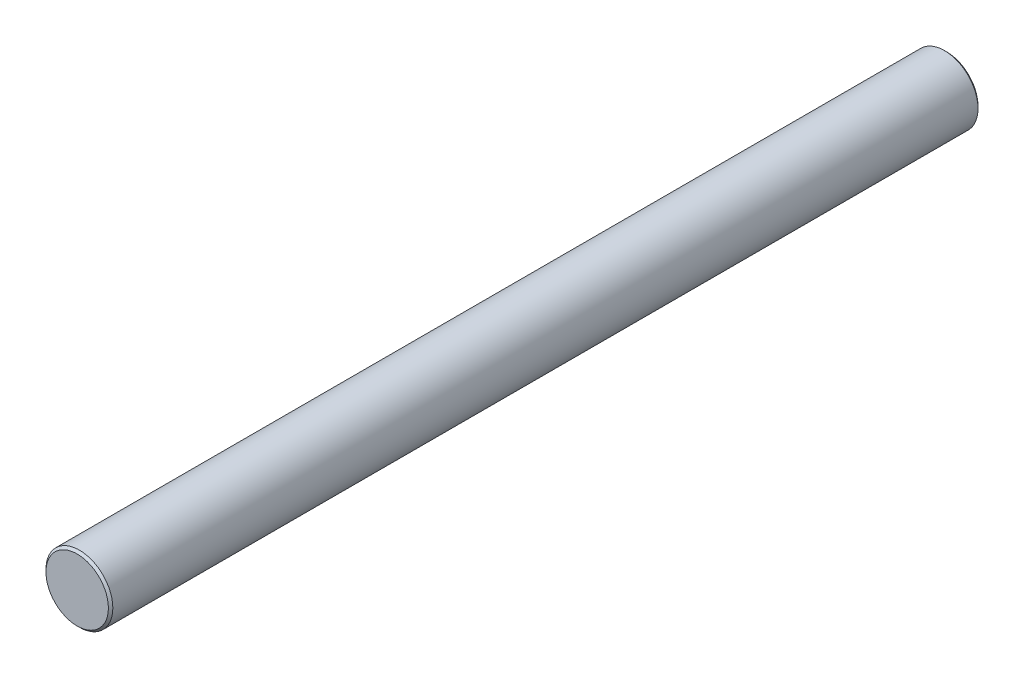
ISO-10303-21;
HEADER;
FILE_DESCRIPTION(('STEP AP214'),'2;1');
FILE_NAME('part.step','',(''),(''),'','','');
FILE_SCHEMA(('AUTOMOTIVE_DESIGN { 1 0 10303 214 1 1 1 1 }'));
ENDSEC;
DATA;
#1=APPLICATION_CONTEXT('core data for automotive mechanical design processes');
#2=APPLICATION_PROTOCOL_DEFINITION('international standard','automotive_design',2000,#1);
#3=PRODUCT_CONTEXT('',#1,'mechanical');
#4=PRODUCT('Part','Part','',(#3));
#5=PRODUCT_RELATED_PRODUCT_CATEGORY('part','',(#4));
#6=PRODUCT_DEFINITION_FORMATION('','',#4);
#7=PRODUCT_DEFINITION_CONTEXT('part definition',#1,'design');
#8=PRODUCT_DEFINITION('design','',#6,#7);
#9=PRODUCT_DEFINITION_SHAPE('','',#8);
#10=(LENGTH_UNIT() NAMED_UNIT(*) SI_UNIT(.MILLI.,.METRE.));
#11=(NAMED_UNIT(*) PLANE_ANGLE_UNIT() SI_UNIT($,.RADIAN.));
#12=(NAMED_UNIT(*) SI_UNIT($,.STERADIAN.) SOLID_ANGLE_UNIT());
#13=UNCERTAINTY_MEASURE_WITH_UNIT(LENGTH_MEASURE(1.E-05),#10,'distance_accuracy_value','');
#14=(GEOMETRIC_REPRESENTATION_CONTEXT(3) GLOBAL_UNCERTAINTY_ASSIGNED_CONTEXT((#13)) GLOBAL_UNIT_ASSIGNED_CONTEXT((#10,
#11,#12)) REPRESENTATION_CONTEXT('',''));
#15=CARTESIAN_POINT('',(0.,0.,0.));
#16=DIRECTION('',(0.,0.,1.));
#17=DIRECTION('',(1.,0.,0.));
#18=AXIS2_PLACEMENT_3D('',#15,#16,#17);
#19=CARTESIAN_POINT('',(0.,0.,39.));
#20=DIRECTION('',(0.,0.,-1.));
#21=DIRECTION('',(-1.,0.,0.));
#22=AXIS2_PLACEMENT_3D('',#19,#20,#21);
#23=CYLINDRICAL_SURFACE('',#22,1.5);
#24=CARTESIAN_POINT('',(0.,0.,38.9));
#25=DIRECTION('',(0.,0.,1.));
#26=DIRECTION('',(1.,0.,0.));
#27=AXIS2_PLACEMENT_3D('',#24,#25,#26);
#28=CIRCLE('',#27,1.5);
#29=CARTESIAN_POINT('',(1.5,0.,38.9));
#30=VERTEX_POINT('',#29);
#31=EDGE_CURVE('E37',#30,#30,#28,.F.);
#32=ORIENTED_EDGE('',*,*,#31,.T.);
#33=EDGE_LOOP('',(#32));
#34=FACE_BOUND('',#33,.T.);
#35=CARTESIAN_POINT('',(0.,0.,0.0999999999999959));
#36=DIRECTION('',(0.,0.,1.));
#37=DIRECTION('',(1.,0.,0.));
#38=AXIS2_PLACEMENT_3D('',#35,#36,#37);
#39=CIRCLE('',#38,1.5);
#40=CARTESIAN_POINT('',(1.5,0.,0.0999999999999959));
#41=VERTEX_POINT('',#40);
#42=EDGE_CURVE('E41',#41,#41,#39,.T.);
#43=ORIENTED_EDGE('',*,*,#42,.T.);
#44=EDGE_LOOP('',(#43));
#45=FACE_BOUND('',#44,.T.);
#46=ADVANCED_FACE('F30',(#34,#45),#23,.T.);
#47=CARTESIAN_POINT('',(0.,0.,39.));
#48=DIRECTION('',(0.,0.,1.));
#49=DIRECTION('',(1.,0.,0.));
#50=AXIS2_PLACEMENT_3D('',#47,#48,#49);
#51=PLANE('',#50);
#52=CARTESIAN_POINT('',(0.,0.,39.));
#53=DIRECTION('',(0.,0.,1.));
#54=DIRECTION('',(1.,0.,0.));
#55=AXIS2_PLACEMENT_3D('',#52,#53,#54);
#56=CIRCLE('',#55,1.39999999999999);
#57=CARTESIAN_POINT('',(1.39999999999999,0.,39.));
#58=VERTEX_POINT('',#57);
#59=EDGE_CURVE('E45',#58,#58,#56,.T.);
#60=ORIENTED_EDGE('',*,*,#59,.T.);
#61=EDGE_LOOP('',(#60));
#62=FACE_BOUND('',#61,.T.);
#63=ADVANCED_FACE('F51',(#62),#51,.T.);
#64=CARTESIAN_POINT('',(0.,0.,0.));
#65=DIRECTION('',(0.,0.,1.));
#66=DIRECTION('',(1.,0.,0.));
#67=AXIS2_PLACEMENT_3D('',#64,#65,#66);
#68=PLANE('',#67);
#69=CARTESIAN_POINT('',(0.,0.,0.));
#70=DIRECTION('',(0.,0.,1.));
#71=DIRECTION('',(1.,0.,0.));
#72=AXIS2_PLACEMENT_3D('',#69,#70,#71);
#73=CIRCLE('',#72,1.4);
#74=CARTESIAN_POINT('',(1.4,0.,0.));
#75=VERTEX_POINT('',#74);
#76=EDGE_CURVE('E10',#75,#75,#73,.F.);
#77=ORIENTED_EDGE('',*,*,#76,.T.);
#78=EDGE_LOOP('',(#77));
#79=FACE_BOUND('',#78,.T.);
#80=ADVANCED_FACE('F55',(#79),#68,.F.);
#81=CARTESIAN_POINT('',(0.,0.,39.));
#82=DIRECTION('',(0.,0.,-1.));
#83=DIRECTION('',(-1.,0.,0.));
#84=AXIS2_PLACEMENT_3D('',#81,#82,#83);
#85=CONICAL_SURFACE('',#84,1.39999999999999,0.78539816339744);
#86=ORIENTED_EDGE('',*,*,#31,.F.);
#87=EDGE_LOOP('',(#86));
#88=FACE_BOUND('',#87,.T.);
#89=ORIENTED_EDGE('',*,*,#59,.F.);
#90=EDGE_LOOP('',(#89));
#91=FACE_BOUND('',#90,.T.);
#92=ADVANCED_FACE('F53',(#88,#91),#85,.T.);
#93=CARTESIAN_POINT('',(0.,0.,0.0999999999999959));
#94=DIRECTION('',(0.,0.,1.));
#95=DIRECTION('',(1.,0.,0.));
#96=AXIS2_PLACEMENT_3D('',#93,#94,#95);
#97=CONICAL_SURFACE('',#96,1.5,0.785398163397474);
#98=ORIENTED_EDGE('',*,*,#76,.F.);
#99=EDGE_LOOP('',(#98));
#100=FACE_BOUND('',#99,.T.);
#101=ORIENTED_EDGE('',*,*,#42,.F.);
#102=EDGE_LOOP('',(#101));
#103=FACE_BOUND('',#102,.T.);
#104=ADVANCED_FACE('F32',(#100,#103),#97,.T.);
#105=CLOSED_SHELL('',(#46,#63,#80,#92,#104));
#106=MANIFOLD_SOLID_BREP('B2',#105);
#107=ADVANCED_BREP_SHAPE_REPRESENTATION('',(#18,#106),#14);
#108=SHAPE_DEFINITION_REPRESENTATION(#9,#107);
ENDSEC;
END-ISO-10303-21;
